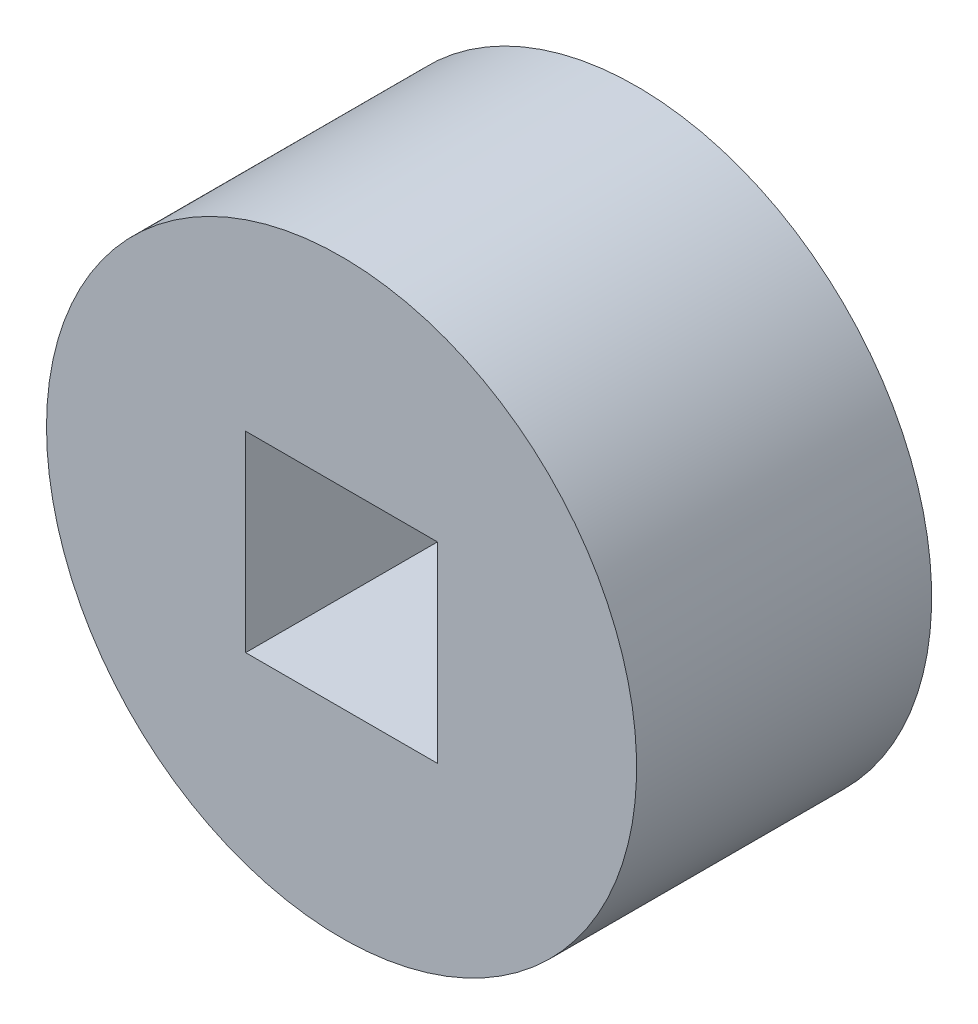
ISO-10303-21;
HEADER;
FILE_DESCRIPTION(('STEP AP214'),'2;1');
FILE_NAME('part.step','',(''),(''),'','','');
FILE_SCHEMA(('AUTOMOTIVE_DESIGN { 1 0 10303 214 1 1 1 1 }'));
ENDSEC;
DATA;
#1=APPLICATION_CONTEXT('core data for automotive mechanical design processes');
#2=APPLICATION_PROTOCOL_DEFINITION('international standard','automotive_design',2000,#1);
#3=PRODUCT_CONTEXT('',#1,'mechanical');
#4=PRODUCT('Part','Part','',(#3));
#5=PRODUCT_RELATED_PRODUCT_CATEGORY('part','',(#4));
#6=PRODUCT_DEFINITION_FORMATION('','',#4);
#7=PRODUCT_DEFINITION_CONTEXT('part definition',#1,'design');
#8=PRODUCT_DEFINITION('design','',#6,#7);
#9=PRODUCT_DEFINITION_SHAPE('','',#8);
#10=(LENGTH_UNIT() NAMED_UNIT(*) SI_UNIT(.MILLI.,.METRE.));
#11=(NAMED_UNIT(*) PLANE_ANGLE_UNIT() SI_UNIT($,.RADIAN.));
#12=(NAMED_UNIT(*) SI_UNIT($,.STERADIAN.) SOLID_ANGLE_UNIT());
#13=UNCERTAINTY_MEASURE_WITH_UNIT(LENGTH_MEASURE(1.E-05),#10,'distance_accuracy_value','');
#14=(GEOMETRIC_REPRESENTATION_CONTEXT(3) GLOBAL_UNCERTAINTY_ASSIGNED_CONTEXT((#13)) GLOBAL_UNIT_ASSIGNED_CONTEXT((#10,
#11,#12)) REPRESENTATION_CONTEXT('',''));
#15=CARTESIAN_POINT('',(0.,0.,0.));
#16=DIRECTION('',(0.,0.,1.));
#17=DIRECTION('',(1.,0.,0.));
#18=AXIS2_PLACEMENT_3D('',#15,#16,#17);
#19=CARTESIAN_POINT('',(0.,0.,0.));
#20=DIRECTION('',(0.,0.,-1.));
#21=DIRECTION('',(-1.,0.,0.));
#22=AXIS2_PLACEMENT_3D('',#19,#20,#21);
#23=PLANE('',#22);
#24=DIRECTION('',(1.,0.,0.));
#25=VECTOR('',#24,1.);
#26=CARTESIAN_POINT('',(-2.6,-2.6,0.));
#27=LINE('',#26,#25);
#28=CARTESIAN_POINT('',(-2.6,-2.6,0.));
#29=VERTEX_POINT('',#28);
#30=CARTESIAN_POINT('',(2.6,-2.6,0.));
#31=VERTEX_POINT('',#30);
#32=EDGE_CURVE('E87',#29,#31,#27,.T.);
#33=ORIENTED_EDGE('',*,*,#32,.F.);
#34=DIRECTION('',(0.,-1.,0.));
#35=VECTOR('',#34,1.);
#36=CARTESIAN_POINT('',(-2.6,-2.6,0.));
#37=LINE('',#36,#35);
#38=CARTESIAN_POINT('',(-2.6,2.6,0.));
#39=VERTEX_POINT('',#38);
#40=EDGE_CURVE('E52',#39,#29,#37,.T.);
#41=ORIENTED_EDGE('',*,*,#40,.F.);
#42=DIRECTION('',(-1.,0.,0.));
#43=VECTOR('',#42,1.);
#44=CARTESIAN_POINT('',(-2.6,2.6,0.));
#45=LINE('',#44,#43);
#46=CARTESIAN_POINT('',(2.6,2.6,0.));
#47=VERTEX_POINT('',#46);
#48=EDGE_CURVE('E103',#47,#39,#45,.T.);
#49=ORIENTED_EDGE('',*,*,#48,.F.);
#50=DIRECTION('',(0.,1.,0.));
#51=VECTOR('',#50,1.);
#52=CARTESIAN_POINT('',(2.6,-2.6,0.));
#53=LINE('',#52,#51);
#54=EDGE_CURVE('E109',#31,#47,#53,.T.);
#55=ORIENTED_EDGE('',*,*,#54,.F.);
#56=EDGE_LOOP('',(#33,#41,#49,#55));
#57=FACE_BOUND('',#56,.T.);
#58=CARTESIAN_POINT('',(0.,0.,0.));
#59=DIRECTION('',(0.,0.,-1.));
#60=DIRECTION('',(-1.,0.,0.));
#61=AXIS2_PLACEMENT_3D('',#58,#59,#60);
#62=CIRCLE('',#61,8.);
#63=CARTESIAN_POINT('',(-8.,0.,0.));
#64=VERTEX_POINT('',#63);
#65=EDGE_CURVE('E11',#64,#64,#62,.T.);
#66=ORIENTED_EDGE('',*,*,#65,.F.);
#67=EDGE_LOOP('',(#66));
#68=FACE_BOUND('',#67,.T.);
#69=ADVANCED_FACE('F38',(#57,#68),#23,.F.);
#70=CARTESIAN_POINT('',(0.,0.,-8.));
#71=DIRECTION('',(0.,0.,-1.));
#72=DIRECTION('',(-1.,0.,0.));
#73=AXIS2_PLACEMENT_3D('',#70,#71,#72);
#74=CYLINDRICAL_SURFACE('',#73,8.);
#75=CARTESIAN_POINT('',(0.,0.,-8.));
#76=DIRECTION('',(0.,0.,-1.));
#77=DIRECTION('',(-1.,0.,0.));
#78=AXIS2_PLACEMENT_3D('',#75,#76,#77);
#79=CIRCLE('',#78,8.);
#80=CARTESIAN_POINT('',(-8.,0.,-8.));
#81=VERTEX_POINT('',#80);
#82=EDGE_CURVE('E45',#81,#81,#79,.T.);
#83=ORIENTED_EDGE('',*,*,#82,.F.);
#84=EDGE_LOOP('',(#83));
#85=FACE_BOUND('',#84,.T.);
#86=ORIENTED_EDGE('',*,*,#65,.T.);
#87=EDGE_LOOP('',(#86));
#88=FACE_BOUND('',#87,.T.);
#89=ADVANCED_FACE('F119',(#85,#88),#74,.T.);
#90=CARTESIAN_POINT('',(8.,0.,-8.));
#91=DIRECTION('',(0.,0.,1.));
#92=DIRECTION('',(1.,0.,0.));
#93=AXIS2_PLACEMENT_3D('',#90,#91,#92);
#94=PLANE('',#93);
#95=ORIENTED_EDGE('',*,*,#82,.T.);
#96=EDGE_LOOP('',(#95));
#97=FACE_BOUND('',#96,.T.);
#98=ADVANCED_FACE('F117',(#97),#94,.F.);
#99=CARTESIAN_POINT('',(-2.6,-2.6,-5.5));
#100=DIRECTION('',(-1.,0.,0.));
#101=DIRECTION('',(0.,0.,1.));
#102=AXIS2_PLACEMENT_3D('',#99,#100,#101);
#103=PLANE('',#102);
#104=ORIENTED_EDGE('',*,*,#40,.T.);
#105=DIRECTION('',(0.,0.,1.));
#106=VECTOR('',#105,1.);
#107=CARTESIAN_POINT('',(-2.6,-2.6,-5.5));
#108=LINE('',#107,#106);
#109=CARTESIAN_POINT('',(-2.6,-2.6,-5.5));
#110=VERTEX_POINT('',#109);
#111=EDGE_CURVE('E75',#110,#29,#108,.T.);
#112=ORIENTED_EDGE('',*,*,#111,.F.);
#113=DIRECTION('',(0.,-1.,0.));
#114=VECTOR('',#113,1.);
#115=CARTESIAN_POINT('',(-2.6,-2.6,-5.5));
#116=LINE('',#115,#114);
#117=CARTESIAN_POINT('',(-2.6,2.6,-5.5));
#118=VERTEX_POINT('',#117);
#119=EDGE_CURVE('E101',#118,#110,#116,.T.);
#120=ORIENTED_EDGE('',*,*,#119,.F.);
#121=DIRECTION('',(0.,0.,1.));
#122=VECTOR('',#121,1.);
#123=CARTESIAN_POINT('',(-2.6,2.6,-5.5));
#124=LINE('',#123,#122);
#125=EDGE_CURVE('E60',#118,#39,#124,.T.);
#126=ORIENTED_EDGE('',*,*,#125,.T.);
#127=EDGE_LOOP('',(#104,#112,#120,#126));
#128=FACE_BOUND('',#127,.T.);
#129=ADVANCED_FACE('F131',(#128),#103,.F.);
#130=CARTESIAN_POINT('',(-2.6,2.6,-5.5));
#131=DIRECTION('',(0.,1.,0.));
#132=DIRECTION('',(0.,0.,1.));
#133=AXIS2_PLACEMENT_3D('',#130,#131,#132);
#134=PLANE('',#133);
#135=ORIENTED_EDGE('',*,*,#48,.T.);
#136=ORIENTED_EDGE('',*,*,#125,.F.);
#137=DIRECTION('',(-1.,0.,0.));
#138=VECTOR('',#137,1.);
#139=CARTESIAN_POINT('',(-2.6,2.6,-5.5));
#140=LINE('',#139,#138);
#141=CARTESIAN_POINT('',(2.6,2.6,-5.5));
#142=VERTEX_POINT('',#141);
#143=EDGE_CURVE('E98',#142,#118,#140,.T.);
#144=ORIENTED_EDGE('',*,*,#143,.F.);
#145=DIRECTION('',(0.,0.,1.));
#146=VECTOR('',#145,1.);
#147=CARTESIAN_POINT('',(2.6,2.6,-5.5));
#148=LINE('',#147,#146);
#149=EDGE_CURVE('E91',#142,#47,#148,.T.);
#150=ORIENTED_EDGE('',*,*,#149,.T.);
#151=EDGE_LOOP('',(#135,#136,#144,#150));
#152=FACE_BOUND('',#151,.T.);
#153=ADVANCED_FACE('F129',(#152),#134,.F.);
#154=CARTESIAN_POINT('',(2.6,-2.6,-5.5));
#155=DIRECTION('',(1.,0.,0.));
#156=DIRECTION('',(0.,0.,-1.));
#157=AXIS2_PLACEMENT_3D('',#154,#155,#156);
#158=PLANE('',#157);
#159=ORIENTED_EDGE('',*,*,#54,.T.);
#160=ORIENTED_EDGE('',*,*,#149,.F.);
#161=DIRECTION('',(0.,1.,0.));
#162=VECTOR('',#161,1.);
#163=CARTESIAN_POINT('',(2.6,-2.6,-5.5));
#164=LINE('',#163,#162);
#165=CARTESIAN_POINT('',(2.6,-2.6,-5.5));
#166=VERTEX_POINT('',#165);
#167=EDGE_CURVE('E94',#166,#142,#164,.T.);
#168=ORIENTED_EDGE('',*,*,#167,.F.);
#169=DIRECTION('',(0.,0.,1.));
#170=VECTOR('',#169,1.);
#171=CARTESIAN_POINT('',(2.6,-2.6,-5.5));
#172=LINE('',#171,#170);
#173=EDGE_CURVE('E80',#166,#31,#172,.T.);
#174=ORIENTED_EDGE('',*,*,#173,.T.);
#175=EDGE_LOOP('',(#159,#160,#168,#174));
#176=FACE_BOUND('',#175,.T.);
#177=ADVANCED_FACE('F95',(#176),#158,.F.);
#178=CARTESIAN_POINT('',(-2.6,-2.6,-5.5));
#179=DIRECTION('',(0.,-1.,0.));
#180=DIRECTION('',(0.,0.,-1.));
#181=AXIS2_PLACEMENT_3D('',#178,#179,#180);
#182=PLANE('',#181);
#183=ORIENTED_EDGE('',*,*,#32,.T.);
#184=ORIENTED_EDGE('',*,*,#173,.F.);
#185=DIRECTION('',(1.,0.,0.));
#186=VECTOR('',#185,1.);
#187=CARTESIAN_POINT('',(-2.6,-2.6,-5.5));
#188=LINE('',#187,#186);
#189=EDGE_CURVE('E84',#110,#166,#188,.T.);
#190=ORIENTED_EDGE('',*,*,#189,.F.);
#191=ORIENTED_EDGE('',*,*,#111,.T.);
#192=EDGE_LOOP('',(#183,#184,#190,#191));
#193=FACE_BOUND('',#192,.T.);
#194=ADVANCED_FACE('F82',(#193),#182,.F.);
#195=CARTESIAN_POINT('',(0.,0.,-5.5));
#196=DIRECTION('',(0.,0.,-1.));
#197=DIRECTION('',(-1.,0.,0.));
#198=AXIS2_PLACEMENT_3D('',#195,#196,#197);
#199=PLANE('',#198);
#200=ORIENTED_EDGE('',*,*,#119,.T.);
#201=ORIENTED_EDGE('',*,*,#189,.T.);
#202=ORIENTED_EDGE('',*,*,#167,.T.);
#203=ORIENTED_EDGE('',*,*,#143,.T.);
#204=EDGE_LOOP('',(#200,#201,#202,#203));
#205=FACE_BOUND('',#204,.T.);
#206=ADVANCED_FACE('F100',(#205),#199,.F.);
#207=CLOSED_SHELL('',(#69,#89,#98,#129,#153,#177,#194,#206));
#208=MANIFOLD_SOLID_BREP('B2',#207);
#209=ADVANCED_BREP_SHAPE_REPRESENTATION('',(#18,#208),#14);
#210=SHAPE_DEFINITION_REPRESENTATION(#9,#209);
ENDSEC;
END-ISO-10303-21;
